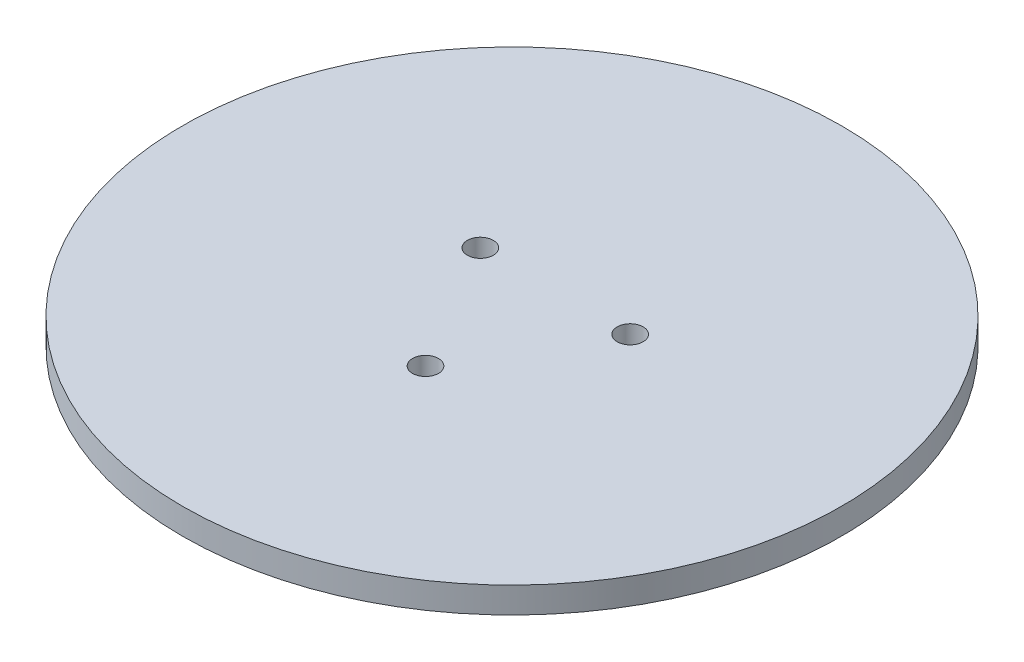
ISO-10303-21;
HEADER;
FILE_DESCRIPTION(('STEP AP214'),'2;1');
FILE_NAME('part.step','',(''),(''),'','','');
FILE_SCHEMA(('AUTOMOTIVE_DESIGN { 1 0 10303 214 1 1 1 1 }'));
ENDSEC;
DATA;
#1=APPLICATION_CONTEXT('core data for automotive mechanical design processes');
#2=APPLICATION_PROTOCOL_DEFINITION('international standard','automotive_design',2000,#1);
#3=PRODUCT_CONTEXT('',#1,'mechanical');
#4=PRODUCT('Part','Part','',(#3));
#5=PRODUCT_RELATED_PRODUCT_CATEGORY('part','',(#4));
#6=PRODUCT_DEFINITION_FORMATION('','',#4);
#7=PRODUCT_DEFINITION_CONTEXT('part definition',#1,'design');
#8=PRODUCT_DEFINITION('design','',#6,#7);
#9=PRODUCT_DEFINITION_SHAPE('','',#8);
#10=(LENGTH_UNIT() NAMED_UNIT(*) SI_UNIT(.MILLI.,.METRE.));
#11=(NAMED_UNIT(*) PLANE_ANGLE_UNIT() SI_UNIT($,.RADIAN.));
#12=(NAMED_UNIT(*) SI_UNIT($,.STERADIAN.) SOLID_ANGLE_UNIT());
#13=UNCERTAINTY_MEASURE_WITH_UNIT(LENGTH_MEASURE(1.E-05),#10,'distance_accuracy_value','');
#14=(GEOMETRIC_REPRESENTATION_CONTEXT(3) GLOBAL_UNCERTAINTY_ASSIGNED_CONTEXT((#13)) GLOBAL_UNIT_ASSIGNED_CONTEXT((#10,
#11,#12)) REPRESENTATION_CONTEXT('',''));
#15=CARTESIAN_POINT('',(0.,0.,0.));
#16=DIRECTION('',(0.,0.,1.));
#17=DIRECTION('',(1.,0.,0.));
#18=AXIS2_PLACEMENT_3D('',#15,#16,#17);
#19=CARTESIAN_POINT('',(0.,3.,0.));
#20=DIRECTION('',(0.,-1.,0.));
#21=DIRECTION('',(0.,0.,-1.));
#22=AXIS2_PLACEMENT_3D('',#19,#20,#21);
#23=CYLINDRICAL_SURFACE('',#22,38.1);
#24=CARTESIAN_POINT('',(0.,3.,0.));
#25=DIRECTION('',(0.,1.,0.));
#26=DIRECTION('',(0.,0.,1.));
#27=AXIS2_PLACEMENT_3D('',#24,#25,#26);
#28=CIRCLE('',#27,38.1);
#29=CARTESIAN_POINT('',(0.,3.,38.1));
#30=VERTEX_POINT('',#29);
#31=EDGE_CURVE('E10',#30,#30,#28,.T.);
#32=ORIENTED_EDGE('',*,*,#31,.F.);
#33=EDGE_LOOP('',(#32));
#34=FACE_BOUND('',#33,.T.);
#35=CARTESIAN_POINT('',(0.,0.,0.));
#36=DIRECTION('',(0.,1.,0.));
#37=DIRECTION('',(0.,0.,1.));
#38=AXIS2_PLACEMENT_3D('',#35,#36,#37);
#39=CIRCLE('',#38,38.1);
#40=CARTESIAN_POINT('',(0.,0.,38.1));
#41=VERTEX_POINT('',#40);
#42=EDGE_CURVE('E34',#41,#41,#39,.T.);
#43=ORIENTED_EDGE('',*,*,#42,.T.);
#44=EDGE_LOOP('',(#43));
#45=FACE_BOUND('',#44,.T.);
#46=ADVANCED_FACE('F31',(#34,#45),#23,.T.);
#47=CARTESIAN_POINT('',(0.,3.,0.));
#48=DIRECTION('',(0.,1.,0.));
#49=DIRECTION('',(0.,0.,1.));
#50=AXIS2_PLACEMENT_3D('',#47,#48,#49);
#51=PLANE('',#50);
#52=CARTESIAN_POINT('',(0.,3.,10.));
#53=DIRECTION('',(0.,1.,0.));
#54=DIRECTION('',(0.,0.,1.));
#55=AXIS2_PLACEMENT_3D('',#52,#53,#54);
#56=CIRCLE('',#55,1.5);
#57=CARTESIAN_POINT('',(0.,3.,11.5));
#58=VERTEX_POINT('',#57);
#59=EDGE_CURVE('E55',#58,#58,#56,.T.);
#60=ORIENTED_EDGE('',*,*,#59,.F.);
#61=EDGE_LOOP('',(#60));
#62=FACE_BOUND('',#61,.T.);
#63=CARTESIAN_POINT('',(8.66025403784443,3.,-4.99999999999992));
#64=DIRECTION('',(0.,1.,0.));
#65=DIRECTION('',(0.,0.,1.));
#66=AXIS2_PLACEMENT_3D('',#63,#64,#65);
#67=CIRCLE('',#66,1.5);
#68=CARTESIAN_POINT('',(8.66025403784443,3.,-3.49999999999992));
#69=VERTEX_POINT('',#68);
#70=EDGE_CURVE('E52',#69,#69,#67,.T.);
#71=ORIENTED_EDGE('',*,*,#70,.F.);
#72=EDGE_LOOP('',(#71));
#73=FACE_BOUND('',#72,.T.);
#74=CARTESIAN_POINT('',(-8.66025403784436,3.,-5.00000000000004));
#75=DIRECTION('',(0.,1.,0.));
#76=DIRECTION('',(0.,0.,1.));
#77=AXIS2_PLACEMENT_3D('',#74,#75,#76);
#78=CIRCLE('',#77,1.5);
#79=CARTESIAN_POINT('',(-8.66025403784436,3.,-3.50000000000004));
#80=VERTEX_POINT('',#79);
#81=EDGE_CURVE('E46',#80,#80,#78,.T.);
#82=ORIENTED_EDGE('',*,*,#81,.F.);
#83=EDGE_LOOP('',(#82));
#84=FACE_BOUND('',#83,.T.);
#85=ORIENTED_EDGE('',*,*,#31,.T.);
#86=EDGE_LOOP('',(#85));
#87=FACE_BOUND('',#86,.T.);
#88=ADVANCED_FACE('F71',(#62,#73,#84,#87),#51,.T.);
#89=CARTESIAN_POINT('',(0.,0.,0.));
#90=DIRECTION('',(0.,1.,0.));
#91=DIRECTION('',(0.,0.,1.));
#92=AXIS2_PLACEMENT_3D('',#89,#90,#91);
#93=PLANE('',#92);
#94=CARTESIAN_POINT('',(0.,0.,10.));
#95=DIRECTION('',(0.,1.,0.));
#96=DIRECTION('',(0.,0.,1.));
#97=AXIS2_PLACEMENT_3D('',#94,#95,#96);
#98=CIRCLE('',#97,1.5);
#99=CARTESIAN_POINT('',(0.,0.,11.5));
#100=VERTEX_POINT('',#99);
#101=EDGE_CURVE('E41',#100,#100,#98,.T.);
#102=ORIENTED_EDGE('',*,*,#101,.T.);
#103=EDGE_LOOP('',(#102));
#104=FACE_BOUND('',#103,.T.);
#105=CARTESIAN_POINT('',(8.66025403784443,0.,-4.99999999999992));
#106=DIRECTION('',(0.,1.,0.));
#107=DIRECTION('',(0.,0.,1.));
#108=AXIS2_PLACEMENT_3D('',#105,#106,#107);
#109=CIRCLE('',#108,1.5);
#110=CARTESIAN_POINT('',(8.66025403784443,0.,-3.49999999999992));
#111=VERTEX_POINT('',#110);
#112=EDGE_CURVE('E49',#111,#111,#109,.T.);
#113=ORIENTED_EDGE('',*,*,#112,.T.);
#114=EDGE_LOOP('',(#113));
#115=FACE_BOUND('',#114,.T.);
#116=CARTESIAN_POINT('',(-8.66025403784436,0.,-5.00000000000004));
#117=DIRECTION('',(0.,1.,0.));
#118=DIRECTION('',(0.,0.,1.));
#119=AXIS2_PLACEMENT_3D('',#116,#117,#118);
#120=CIRCLE('',#119,1.5);
#121=CARTESIAN_POINT('',(-8.66025403784436,0.,-3.50000000000004));
#122=VERTEX_POINT('',#121);
#123=EDGE_CURVE('E43',#122,#122,#120,.T.);
#124=ORIENTED_EDGE('',*,*,#123,.T.);
#125=EDGE_LOOP('',(#124));
#126=FACE_BOUND('',#125,.T.);
#127=ORIENTED_EDGE('',*,*,#42,.F.);
#128=EDGE_LOOP('',(#127));
#129=FACE_BOUND('',#128,.T.);
#130=ADVANCED_FACE('F61',(#104,#115,#126,#129),#93,.F.);
#131=CARTESIAN_POINT('',(-8.66025403784436,0.,-5.00000000000004));
#132=DIRECTION('',(0.,1.,0.));
#133=DIRECTION('',(0.,0.,1.));
#134=AXIS2_PLACEMENT_3D('',#131,#132,#133);
#135=CYLINDRICAL_SURFACE('',#134,1.5);
#136=ORIENTED_EDGE('',*,*,#123,.F.);
#137=EDGE_LOOP('',(#136));
#138=FACE_BOUND('',#137,.T.);
#139=ORIENTED_EDGE('',*,*,#81,.T.);
#140=EDGE_LOOP('',(#139));
#141=FACE_BOUND('',#140,.T.);
#142=ADVANCED_FACE('F79',(#138,#141),#135,.F.);
#143=CARTESIAN_POINT('',(8.66025403784443,0.,-4.99999999999992));
#144=DIRECTION('',(0.,1.,0.));
#145=DIRECTION('',(0.,0.,1.));
#146=AXIS2_PLACEMENT_3D('',#143,#144,#145);
#147=CYLINDRICAL_SURFACE('',#146,1.5);
#148=ORIENTED_EDGE('',*,*,#112,.F.);
#149=EDGE_LOOP('',(#148));
#150=FACE_BOUND('',#149,.T.);
#151=ORIENTED_EDGE('',*,*,#70,.T.);
#152=EDGE_LOOP('',(#151));
#153=FACE_BOUND('',#152,.T.);
#154=ADVANCED_FACE('F67',(#150,#153),#147,.F.);
#155=CARTESIAN_POINT('',(0.,0.,10.));
#156=DIRECTION('',(0.,1.,0.));
#157=DIRECTION('',(0.,0.,1.));
#158=AXIS2_PLACEMENT_3D('',#155,#156,#157);
#159=CYLINDRICAL_SURFACE('',#158,1.5);
#160=ORIENTED_EDGE('',*,*,#101,.F.);
#161=EDGE_LOOP('',(#160));
#162=FACE_BOUND('',#161,.T.);
#163=ORIENTED_EDGE('',*,*,#59,.T.);
#164=EDGE_LOOP('',(#163));
#165=FACE_BOUND('',#164,.T.);
#166=ADVANCED_FACE('F64',(#162,#165),#159,.F.);
#167=CLOSED_SHELL('',(#46,#88,#130,#142,#154,#166));
#168=MANIFOLD_SOLID_BREP('B2',#167);
#169=ADVANCED_BREP_SHAPE_REPRESENTATION('',(#18,#168),#14);
#170=SHAPE_DEFINITION_REPRESENTATION(#9,#169);
ENDSEC;
END-ISO-10303-21;
